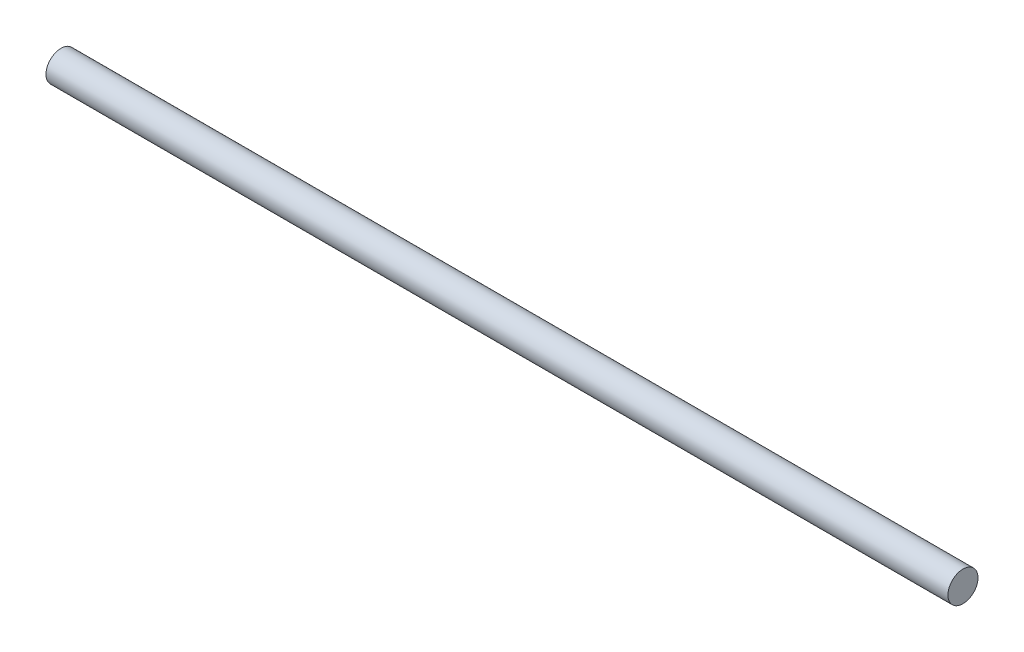
ISO-10303-21;
HEADER;
FILE_DESCRIPTION(('STEP AP214'),'2;1');
FILE_NAME('part.step','',(''),(''),'','','');
FILE_SCHEMA(('AUTOMOTIVE_DESIGN { 1 0 10303 214 1 1 1 1 }'));
ENDSEC;
DATA;
#1=APPLICATION_CONTEXT('core data for automotive mechanical design processes');
#2=APPLICATION_PROTOCOL_DEFINITION('international standard','automotive_design',2000,#1);
#3=PRODUCT_CONTEXT('',#1,'mechanical');
#4=PRODUCT('Part','Part','',(#3));
#5=PRODUCT_RELATED_PRODUCT_CATEGORY('part','',(#4));
#6=PRODUCT_DEFINITION_FORMATION('','',#4);
#7=PRODUCT_DEFINITION_CONTEXT('part definition',#1,'design');
#8=PRODUCT_DEFINITION('design','',#6,#7);
#9=PRODUCT_DEFINITION_SHAPE('','',#8);
#10=(LENGTH_UNIT() NAMED_UNIT(*) SI_UNIT(.MILLI.,.METRE.));
#11=(NAMED_UNIT(*) PLANE_ANGLE_UNIT() SI_UNIT($,.RADIAN.));
#12=(NAMED_UNIT(*) SI_UNIT($,.STERADIAN.) SOLID_ANGLE_UNIT());
#13=UNCERTAINTY_MEASURE_WITH_UNIT(LENGTH_MEASURE(1.E-05),#10,'distance_accuracy_value','');
#14=(GEOMETRIC_REPRESENTATION_CONTEXT(3) GLOBAL_UNCERTAINTY_ASSIGNED_CONTEXT((#13)) GLOBAL_UNIT_ASSIGNED_CONTEXT((#10,
#11,#12)) REPRESENTATION_CONTEXT('',''));
#15=CARTESIAN_POINT('',(0.,0.,0.));
#16=DIRECTION('',(0.,0.,1.));
#17=DIRECTION('',(1.,0.,0.));
#18=AXIS2_PLACEMENT_3D('',#15,#16,#17);
#19=CARTESIAN_POINT('',(75.,0.,0.));
#20=DIRECTION('',(-1.,0.,0.));
#21=DIRECTION('',(0.,0.,1.));
#22=AXIS2_PLACEMENT_3D('',#19,#20,#21);
#23=CYLINDRICAL_SURFACE('',#22,1.25);
#24=CARTESIAN_POINT('',(75.,0.,0.));
#25=DIRECTION('',(1.,0.,0.));
#26=DIRECTION('',(0.,0.,-1.));
#27=AXIS2_PLACEMENT_3D('',#24,#25,#26);
#28=CIRCLE('',#27,1.25);
#29=CARTESIAN_POINT('',(75.,0.,-1.25));
#30=VERTEX_POINT('',#29);
#31=EDGE_CURVE('E10',#30,#30,#28,.T.);
#32=ORIENTED_EDGE('',*,*,#31,.F.);
#33=EDGE_LOOP('',(#32));
#34=FACE_BOUND('',#33,.T.);
#35=CARTESIAN_POINT('',(0.,0.,0.));
#36=DIRECTION('',(1.,0.,0.));
#37=DIRECTION('',(0.,0.,-1.));
#38=AXIS2_PLACEMENT_3D('',#35,#36,#37);
#39=CIRCLE('',#38,1.25);
#40=CARTESIAN_POINT('',(0.,0.,-1.25));
#41=VERTEX_POINT('',#40);
#42=EDGE_CURVE('E34',#41,#41,#39,.T.);
#43=ORIENTED_EDGE('',*,*,#42,.T.);
#44=EDGE_LOOP('',(#43));
#45=FACE_BOUND('',#44,.T.);
#46=ADVANCED_FACE('F31',(#34,#45),#23,.T.);
#47=CARTESIAN_POINT('',(75.,0.,0.));
#48=DIRECTION('',(1.,0.,0.));
#49=DIRECTION('',(0.,0.,-1.));
#50=AXIS2_PLACEMENT_3D('',#47,#48,#49);
#51=PLANE('',#50);
#52=ORIENTED_EDGE('',*,*,#31,.T.);
#53=EDGE_LOOP('',(#52));
#54=FACE_BOUND('',#53,.T.);
#55=ADVANCED_FACE('F46',(#54),#51,.T.);
#56=CARTESIAN_POINT('',(0.,0.,0.));
#57=DIRECTION('',(1.,0.,0.));
#58=DIRECTION('',(0.,0.,-1.));
#59=AXIS2_PLACEMENT_3D('',#56,#57,#58);
#60=PLANE('',#59);
#61=ORIENTED_EDGE('',*,*,#42,.F.);
#62=EDGE_LOOP('',(#61));
#63=FACE_BOUND('',#62,.T.);
#64=ADVANCED_FACE('F44',(#63),#60,.F.);
#65=CLOSED_SHELL('',(#46,#55,#64));
#66=MANIFOLD_SOLID_BREP('B2',#65);
#67=ADVANCED_BREP_SHAPE_REPRESENTATION('',(#18,#66),#14);
#68=SHAPE_DEFINITION_REPRESENTATION(#9,#67);
ENDSEC;
END-ISO-10303-21;
